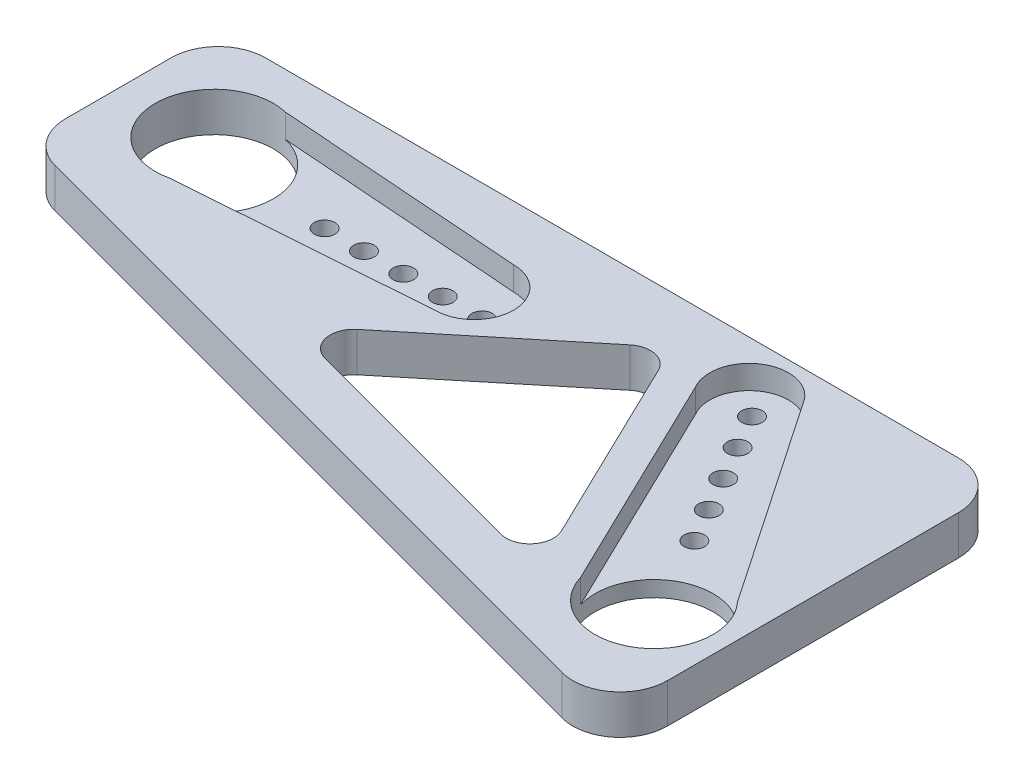
ISO-10303-21;
HEADER;
FILE_DESCRIPTION(('STEP AP214'),'2;1');
FILE_NAME('part.step','',(''),(''),'','','');
FILE_SCHEMA(('AUTOMOTIVE_DESIGN { 1 0 10303 214 1 1 1 1 }'));
ENDSEC;
DATA;
#1=APPLICATION_CONTEXT('core data for automotive mechanical design processes');
#2=APPLICATION_PROTOCOL_DEFINITION('international standard','automotive_design',2000,#1);
#3=PRODUCT_CONTEXT('',#1,'mechanical');
#4=PRODUCT('Part','Part','',(#3));
#5=PRODUCT_RELATED_PRODUCT_CATEGORY('part','',(#4));
#6=PRODUCT_DEFINITION_FORMATION('','',#4);
#7=PRODUCT_DEFINITION_CONTEXT('part definition',#1,'design');
#8=PRODUCT_DEFINITION('design','',#6,#7);
#9=PRODUCT_DEFINITION_SHAPE('','',#8);
#10=(LENGTH_UNIT() NAMED_UNIT(*) SI_UNIT(.MILLI.,.METRE.));
#11=(NAMED_UNIT(*) PLANE_ANGLE_UNIT() SI_UNIT($,.RADIAN.));
#12=(NAMED_UNIT(*) SI_UNIT($,.STERADIAN.) SOLID_ANGLE_UNIT());
#13=UNCERTAINTY_MEASURE_WITH_UNIT(LENGTH_MEASURE(1.E-05),#10,'distance_accuracy_value','');
#14=(GEOMETRIC_REPRESENTATION_CONTEXT(3) GLOBAL_UNCERTAINTY_ASSIGNED_CONTEXT((#13)) GLOBAL_UNIT_ASSIGNED_CONTEXT((#10,
#11,#12)) REPRESENTATION_CONTEXT('',''));
#15=CARTESIAN_POINT('',(0.,0.,0.));
#16=DIRECTION('',(0.,0.,1.));
#17=DIRECTION('',(1.,0.,0.));
#18=AXIS2_PLACEMENT_3D('',#15,#16,#17);
#19=CARTESIAN_POINT('',(37.916201182934,2.5,4.94263164512558));
#20=DIRECTION('',(0.,-1.,0.));
#21=DIRECTION('',(0.,0.,1.));
#22=AXIS2_PLACEMENT_3D('',#19,#20,#21);
#23=CYLINDRICAL_SURFACE('',#22,0.649999999999983);
#24=CARTESIAN_POINT('',(37.916201182934,0.,4.94263164512558));
#25=DIRECTION('',(0.,-1.,0.));
#26=DIRECTION('',(0.,0.,-1.));
#27=AXIS2_PLACEMENT_3D('',#24,#25,#26);
#28=CIRCLE('',#27,0.649999999999983);
#29=CARTESIAN_POINT('',(37.916201182934,0.,4.2926316451256));
#30=VERTEX_POINT('',#29);
#31=EDGE_CURVE('E335',#30,#30,#28,.T.);
#32=ORIENTED_EDGE('',*,*,#31,.T.);
#33=EDGE_LOOP('',(#32));
#34=FACE_BOUND('',#33,.T.);
#35=CARTESIAN_POINT('',(37.916201182934,1.,4.94263164512558));
#36=DIRECTION('',(0.,-1.,0.));
#37=DIRECTION('',(0.,0.,-1.));
#38=AXIS2_PLACEMENT_3D('',#35,#36,#37);
#39=CIRCLE('',#38,0.649999999999983);
#40=CARTESIAN_POINT('',(37.916201182934,1.,4.2926316451256));
#41=VERTEX_POINT('',#40);
#42=EDGE_CURVE('E243',#41,#41,#39,.F.);
#43=ORIENTED_EDGE('',*,*,#42,.T.);
#44=EDGE_LOOP('',(#43));
#45=FACE_BOUND('',#44,.T.);
#46=ADVANCED_FACE('F37',(#34,#45),#23,.F.);
#47=CARTESIAN_POINT('',(39.166201182934,2.5,7.10769515458668));
#48=DIRECTION('',(0.,-1.,0.));
#49=DIRECTION('',(0.,0.,1.));
#50=AXIS2_PLACEMENT_3D('',#47,#48,#49);
#51=CYLINDRICAL_SURFACE('',#50,0.649999999999983);
#52=CARTESIAN_POINT('',(39.166201182934,0.,7.10769515458668));
#53=DIRECTION('',(0.,-1.,0.));
#54=DIRECTION('',(0.,0.,-1.));
#55=AXIS2_PLACEMENT_3D('',#52,#53,#54);
#56=CIRCLE('',#55,0.649999999999983);
#57=CARTESIAN_POINT('',(39.166201182934,0.,6.4576951545867));
#58=VERTEX_POINT('',#57);
#59=EDGE_CURVE('E332',#58,#58,#56,.T.);
#60=ORIENTED_EDGE('',*,*,#59,.T.);
#61=EDGE_LOOP('',(#60));
#62=FACE_BOUND('',#61,.T.);
#63=CARTESIAN_POINT('',(39.166201182934,1.,7.10769515458668));
#64=DIRECTION('',(0.,-1.,0.));
#65=DIRECTION('',(0.,0.,-1.));
#66=AXIS2_PLACEMENT_3D('',#63,#64,#65);
#67=CIRCLE('',#66,0.649999999999983);
#68=CARTESIAN_POINT('',(39.166201182934,1.,6.4576951545867));
#69=VERTEX_POINT('',#68);
#70=EDGE_CURVE('E240',#69,#69,#67,.F.);
#71=ORIENTED_EDGE('',*,*,#70,.T.);
#72=EDGE_LOOP('',(#71));
#73=FACE_BOUND('',#72,.T.);
#74=ADVANCED_FACE('F455',(#62,#73),#51,.F.);
#75=CARTESIAN_POINT('',(40.416201182934,2.5,9.27275866404778));
#76=DIRECTION('',(0.,-1.,0.));
#77=DIRECTION('',(0.,0.,1.));
#78=AXIS2_PLACEMENT_3D('',#75,#76,#77);
#79=CYLINDRICAL_SURFACE('',#78,0.649999999999983);
#80=CARTESIAN_POINT('',(40.416201182934,0.,9.27275866404778));
#81=DIRECTION('',(0.,-1.,0.));
#82=DIRECTION('',(0.,0.,-1.));
#83=AXIS2_PLACEMENT_3D('',#80,#81,#82);
#84=CIRCLE('',#83,0.649999999999983);
#85=CARTESIAN_POINT('',(40.416201182934,0.,8.62275866404779));
#86=VERTEX_POINT('',#85);
#87=EDGE_CURVE('E329',#86,#86,#84,.T.);
#88=ORIENTED_EDGE('',*,*,#87,.T.);
#89=EDGE_LOOP('',(#88));
#90=FACE_BOUND('',#89,.T.);
#91=CARTESIAN_POINT('',(40.416201182934,1.,9.27275866404778));
#92=DIRECTION('',(0.,-1.,0.));
#93=DIRECTION('',(0.,0.,-1.));
#94=AXIS2_PLACEMENT_3D('',#91,#92,#93);
#95=CIRCLE('',#94,0.649999999999983);
#96=CARTESIAN_POINT('',(40.416201182934,1.,8.62275866404779));
#97=VERTEX_POINT('',#96);
#98=EDGE_CURVE('E236',#97,#97,#95,.F.);
#99=ORIENTED_EDGE('',*,*,#98,.T.);
#100=EDGE_LOOP('',(#99));
#101=FACE_BOUND('',#100,.T.);
#102=ADVANCED_FACE('F461',(#90,#101),#79,.F.);
#103=CARTESIAN_POINT('',(41.666201182934,2.5,11.4378221735089));
#104=DIRECTION('',(0.,-1.,0.));
#105=DIRECTION('',(0.,0.,1.));
#106=AXIS2_PLACEMENT_3D('',#103,#104,#105);
#107=CYLINDRICAL_SURFACE('',#106,0.649999999999983);
#108=CARTESIAN_POINT('',(41.666201182934,0.,11.4378221735089));
#109=DIRECTION('',(0.,-1.,0.));
#110=DIRECTION('',(0.,0.,-1.));
#111=AXIS2_PLACEMENT_3D('',#108,#109,#110);
#112=CIRCLE('',#111,0.649999999999983);
#113=CARTESIAN_POINT('',(41.666201182934,0.,10.7878221735089));
#114=VERTEX_POINT('',#113);
#115=EDGE_CURVE('E326',#114,#114,#112,.T.);
#116=ORIENTED_EDGE('',*,*,#115,.T.);
#117=EDGE_LOOP('',(#116));
#118=FACE_BOUND('',#117,.T.);
#119=CARTESIAN_POINT('',(41.666201182934,1.,11.4378221735089));
#120=DIRECTION('',(0.,-1.,0.));
#121=DIRECTION('',(0.,0.,-1.));
#122=AXIS2_PLACEMENT_3D('',#119,#120,#121);
#123=CIRCLE('',#122,0.649999999999983);
#124=CARTESIAN_POINT('',(41.666201182934,1.,10.7878221735089));
#125=VERTEX_POINT('',#124);
#126=EDGE_CURVE('E233',#125,#125,#123,.F.);
#127=ORIENTED_EDGE('',*,*,#126,.T.);
#128=EDGE_LOOP('',(#127));
#129=FACE_BOUND('',#128,.T.);
#130=ADVANCED_FACE('F469',(#118,#129),#107,.F.);
#131=CARTESIAN_POINT('',(22.75,2.5,6.));
#132=DIRECTION('',(0.,-1.,0.));
#133=DIRECTION('',(0.,0.,1.));
#134=AXIS2_PLACEMENT_3D('',#131,#132,#133);
#135=CYLINDRICAL_SURFACE('',#134,0.650000000000001);
#136=CARTESIAN_POINT('',(22.75,0.,6.));
#137=DIRECTION('',(0.,-1.,0.));
#138=DIRECTION('',(0.,0.,-1.));
#139=AXIS2_PLACEMENT_3D('',#136,#137,#138);
#140=CIRCLE('',#139,0.650000000000001);
#141=CARTESIAN_POINT('',(22.75,0.,5.35));
#142=VERTEX_POINT('',#141);
#143=EDGE_CURVE('E323',#142,#142,#140,.T.);
#144=ORIENTED_EDGE('',*,*,#143,.T.);
#145=EDGE_LOOP('',(#144));
#146=FACE_BOUND('',#145,.T.);
#147=CARTESIAN_POINT('',(22.75,1.,6.));
#148=DIRECTION('',(0.,-1.,0.));
#149=DIRECTION('',(0.,0.,-1.));
#150=AXIS2_PLACEMENT_3D('',#147,#148,#149);
#151=CIRCLE('',#150,0.650000000000001);
#152=CARTESIAN_POINT('',(22.75,1.,5.35));
#153=VERTEX_POINT('',#152);
#154=EDGE_CURVE('E424',#153,#153,#151,.F.);
#155=ORIENTED_EDGE('',*,*,#154,.T.);
#156=EDGE_LOOP('',(#155));
#157=FACE_BOUND('',#156,.T.);
#158=ADVANCED_FACE('F473',(#146,#157),#135,.F.);
#159=CARTESIAN_POINT('',(20.25,2.5,6.));
#160=DIRECTION('',(0.,-1.,0.));
#161=DIRECTION('',(0.,0.,1.));
#162=AXIS2_PLACEMENT_3D('',#159,#160,#161);
#163=CYLINDRICAL_SURFACE('',#162,0.650000000000001);
#164=CARTESIAN_POINT('',(20.25,0.,6.));
#165=DIRECTION('',(0.,-1.,0.));
#166=DIRECTION('',(0.,0.,-1.));
#167=AXIS2_PLACEMENT_3D('',#164,#165,#166);
#168=CIRCLE('',#167,0.650000000000001);
#169=CARTESIAN_POINT('',(20.25,0.,5.35));
#170=VERTEX_POINT('',#169);
#171=EDGE_CURVE('E320',#170,#170,#168,.T.);
#172=ORIENTED_EDGE('',*,*,#171,.T.);
#173=EDGE_LOOP('',(#172));
#174=FACE_BOUND('',#173,.T.);
#175=CARTESIAN_POINT('',(20.25,1.,6.));
#176=DIRECTION('',(0.,-1.,0.));
#177=DIRECTION('',(0.,0.,-1.));
#178=AXIS2_PLACEMENT_3D('',#175,#176,#177);
#179=CIRCLE('',#178,0.650000000000001);
#180=CARTESIAN_POINT('',(20.25,1.,5.35));
#181=VERTEX_POINT('',#180);
#182=EDGE_CURVE('E421',#181,#181,#179,.F.);
#183=ORIENTED_EDGE('',*,*,#182,.T.);
#184=EDGE_LOOP('',(#183));
#185=FACE_BOUND('',#184,.T.);
#186=ADVANCED_FACE('F477',(#174,#185),#163,.F.);
#187=CARTESIAN_POINT('',(17.75,2.5,6.));
#188=DIRECTION('',(0.,-1.,0.));
#189=DIRECTION('',(0.,0.,1.));
#190=AXIS2_PLACEMENT_3D('',#187,#188,#189);
#191=CYLINDRICAL_SURFACE('',#190,0.650000000000001);
#192=CARTESIAN_POINT('',(17.75,0.,6.));
#193=DIRECTION('',(0.,-1.,0.));
#194=DIRECTION('',(0.,0.,-1.));
#195=AXIS2_PLACEMENT_3D('',#192,#193,#194);
#196=CIRCLE('',#195,0.650000000000001);
#197=CARTESIAN_POINT('',(17.75,0.,5.35));
#198=VERTEX_POINT('',#197);
#199=EDGE_CURVE('E317',#198,#198,#196,.T.);
#200=ORIENTED_EDGE('',*,*,#199,.T.);
#201=EDGE_LOOP('',(#200));
#202=FACE_BOUND('',#201,.T.);
#203=CARTESIAN_POINT('',(17.75,1.,6.));
#204=DIRECTION('',(0.,-1.,0.));
#205=DIRECTION('',(0.,0.,-1.));
#206=AXIS2_PLACEMENT_3D('',#203,#204,#205);
#207=CIRCLE('',#206,0.650000000000001);
#208=CARTESIAN_POINT('',(17.75,1.,5.35));
#209=VERTEX_POINT('',#208);
#210=EDGE_CURVE('E213',#209,#209,#207,.F.);
#211=ORIENTED_EDGE('',*,*,#210,.T.);
#212=EDGE_LOOP('',(#211));
#213=FACE_BOUND('',#212,.T.);
#214=ADVANCED_FACE('F429',(#202,#213),#191,.F.);
#215=CARTESIAN_POINT('',(15.25,2.5,6.));
#216=DIRECTION('',(0.,-1.,0.));
#217=DIRECTION('',(0.,0.,1.));
#218=AXIS2_PLACEMENT_3D('',#215,#216,#217);
#219=CYLINDRICAL_SURFACE('',#218,0.650000000000001);
#220=CARTESIAN_POINT('',(15.25,0.,6.));
#221=DIRECTION('',(0.,-1.,0.));
#222=DIRECTION('',(0.,0.,-1.));
#223=AXIS2_PLACEMENT_3D('',#220,#221,#222);
#224=CIRCLE('',#223,0.650000000000001);
#225=CARTESIAN_POINT('',(15.25,0.,5.35));
#226=VERTEX_POINT('',#225);
#227=EDGE_CURVE('E314',#226,#226,#224,.T.);
#228=ORIENTED_EDGE('',*,*,#227,.T.);
#229=EDGE_LOOP('',(#228));
#230=FACE_BOUND('',#229,.T.);
#231=CARTESIAN_POINT('',(15.25,1.,6.));
#232=DIRECTION('',(0.,-1.,0.));
#233=DIRECTION('',(0.,0.,-1.));
#234=AXIS2_PLACEMENT_3D('',#231,#232,#233);
#235=CIRCLE('',#234,0.650000000000001);
#236=CARTESIAN_POINT('',(15.25,1.,5.35));
#237=VERTEX_POINT('',#236);
#238=EDGE_CURVE('E226',#237,#237,#235,.F.);
#239=ORIENTED_EDGE('',*,*,#238,.T.);
#240=EDGE_LOOP('',(#239));
#241=FACE_BOUND('',#240,.T.);
#242=ADVANCED_FACE('F441',(#230,#241),#219,.F.);
#243=CARTESIAN_POINT('',(12.75,2.5,6.));
#244=DIRECTION('',(0.,-1.,0.));
#245=DIRECTION('',(0.,0.,1.));
#246=AXIS2_PLACEMENT_3D('',#243,#244,#245);
#247=CYLINDRICAL_SURFACE('',#246,0.650000000000001);
#248=CARTESIAN_POINT('',(12.75,0.,6.));
#249=DIRECTION('',(0.,-1.,0.));
#250=DIRECTION('',(0.,0.,-1.));
#251=AXIS2_PLACEMENT_3D('',#248,#249,#250);
#252=CIRCLE('',#251,0.650000000000001);
#253=CARTESIAN_POINT('',(12.75,0.,5.35));
#254=VERTEX_POINT('',#253);
#255=EDGE_CURVE('E311',#254,#254,#252,.T.);
#256=ORIENTED_EDGE('',*,*,#255,.T.);
#257=EDGE_LOOP('',(#256));
#258=FACE_BOUND('',#257,.T.);
#259=CARTESIAN_POINT('',(12.75,1.,6.));
#260=DIRECTION('',(0.,-1.,0.));
#261=DIRECTION('',(0.,0.,-1.));
#262=AXIS2_PLACEMENT_3D('',#259,#260,#261);
#263=CIRCLE('',#262,0.650000000000001);
#264=CARTESIAN_POINT('',(12.75,1.,5.35));
#265=VERTEX_POINT('',#264);
#266=EDGE_CURVE('E210',#265,#265,#263,.F.);
#267=ORIENTED_EDGE('',*,*,#266,.T.);
#268=EDGE_LOOP('',(#267));
#269=FACE_BOUND('',#268,.T.);
#270=ADVANCED_FACE('F438',(#258,#269),#247,.F.);
#271=CARTESIAN_POINT('',(36.666201182934,2.5,2.77756813566448));
#272=DIRECTION('',(0.,-1.,0.));
#273=DIRECTION('',(0.,0.,1.));
#274=AXIS2_PLACEMENT_3D('',#271,#272,#273);
#275=CYLINDRICAL_SURFACE('',#274,0.649999999999975);
#276=CARTESIAN_POINT('',(36.666201182934,0.,2.77756813566448));
#277=DIRECTION('',(0.,-1.,0.));
#278=DIRECTION('',(0.,0.,-1.));
#279=AXIS2_PLACEMENT_3D('',#276,#277,#278);
#280=CIRCLE('',#279,0.649999999999975);
#281=CARTESIAN_POINT('',(36.666201182934,0.,2.12756813566451));
#282=VERTEX_POINT('',#281);
#283=EDGE_CURVE('E278',#282,#282,#280,.T.);
#284=ORIENTED_EDGE('',*,*,#283,.T.);
#285=EDGE_LOOP('',(#284));
#286=FACE_BOUND('',#285,.T.);
#287=CARTESIAN_POINT('',(36.666201182934,1.,2.77756813566448));
#288=DIRECTION('',(0.,-1.,0.));
#289=DIRECTION('',(0.,0.,-1.));
#290=AXIS2_PLACEMENT_3D('',#287,#288,#289);
#291=CIRCLE('',#290,0.649999999999975);
#292=CARTESIAN_POINT('',(36.666201182934,1.,2.12756813566451));
#293=VERTEX_POINT('',#292);
#294=EDGE_CURVE('E246',#293,#293,#291,.F.);
#295=ORIENTED_EDGE('',*,*,#294,.T.);
#296=EDGE_LOOP('',(#295));
#297=FACE_BOUND('',#296,.T.);
#298=ADVANCED_FACE('F440',(#286,#297),#275,.F.);
#299=CARTESIAN_POINT('',(50.,2.5,0.));
#300=DIRECTION('',(1.,0.,0.));
#301=DIRECTION('',(0.,0.,1.));
#302=AXIS2_PLACEMENT_3D('',#299,#300,#301);
#303=PLANE('',#302);
#304=DIRECTION('',(0.,0.,-1.));
#305=VECTOR('',#304,1.);
#306=CARTESIAN_POINT('',(50.,0.,0.));
#307=LINE('',#306,#305);
#308=CARTESIAN_POINT('',(50.,0.,21.4877835030326));
#309=VERTEX_POINT('',#308);
#310=CARTESIAN_POINT('',(50.,0.,3.));
#311=VERTEX_POINT('',#310);
#312=EDGE_CURVE('E299',#309,#311,#307,.T.);
#313=ORIENTED_EDGE('',*,*,#312,.T.);
#314=DIRECTION('',(0.,-1.,0.));
#315=VECTOR('',#314,1.);
#316=CARTESIAN_POINT('',(50.,0.,3.));
#317=LINE('',#316,#315);
#318=CARTESIAN_POINT('',(50.,2.5,3.));
#319=VERTEX_POINT('',#318);
#320=EDGE_CURVE('E373',#319,#311,#317,.T.);
#321=ORIENTED_EDGE('',*,*,#320,.F.);
#322=DIRECTION('',(0.,0.,-1.));
#323=VECTOR('',#322,1.);
#324=CARTESIAN_POINT('',(50.,2.5,0.));
#325=LINE('',#324,#323);
#326=CARTESIAN_POINT('',(50.,2.5,21.4877835030326));
#327=VERTEX_POINT('',#326);
#328=EDGE_CURVE('E281',#327,#319,#325,.T.);
#329=ORIENTED_EDGE('',*,*,#328,.F.);
#330=DIRECTION('',(0.,-1.,0.));
#331=VECTOR('',#330,1.);
#332=CARTESIAN_POINT('',(50.,2.5,21.4877835030326));
#333=LINE('',#332,#331);
#334=EDGE_CURVE('E376',#309,#327,#333,.F.);
#335=ORIENTED_EDGE('',*,*,#334,.F.);
#336=EDGE_LOOP('',(#313,#321,#329,#335));
#337=FACE_BOUND('',#336,.T.);
#338=ADVANCED_FACE('F448',(#337),#303,.T.);
#339=CARTESIAN_POINT('',(-3.00000000000001,2.5,11.1961524227066));
#340=DIRECTION('',(-0.258819045102522,0.,0.965925826289068));
#341=DIRECTION('',(-0.965925826289068,0.,-0.258819045102522));
#342=AXIS2_PLACEMENT_3D('',#339,#340,#341);
#343=PLANE('',#342);
#344=DIRECTION('',(0.965925826289068,0.,0.258819045102522));
#345=VECTOR('',#344,1.);
#346=CARTESIAN_POINT('',(-3.00000000000001,0.,11.1961524227066));
#347=LINE('',#346,#345);
#348=CARTESIAN_POINT('',(2.22354286469244,0.,12.5957965149303));
#349=VERTEX_POINT('',#348);
#350=CARTESIAN_POINT('',(46.2235428646924,0.,24.3855609818998));
#351=VERTEX_POINT('',#350);
#352=EDGE_CURVE('E302',#349,#351,#347,.T.);
#353=ORIENTED_EDGE('',*,*,#352,.T.);
#354=DIRECTION('',(0.,-1.,0.));
#355=VECTOR('',#354,1.);
#356=CARTESIAN_POINT('',(46.2235428646924,2.5,24.3855609818998));
#357=LINE('',#356,#355);
#358=CARTESIAN_POINT('',(46.2235428646924,2.5,24.3855609818998));
#359=VERTEX_POINT('',#358);
#360=EDGE_CURVE('E367',#359,#351,#357,.T.);
#361=ORIENTED_EDGE('',*,*,#360,.F.);
#362=DIRECTION('',(0.965925826289068,0.,0.258819045102522));
#363=VECTOR('',#362,1.);
#364=CARTESIAN_POINT('',(-3.00000000000001,2.5,11.1961524227066));
#365=LINE('',#364,#363);
#366=CARTESIAN_POINT('',(2.22354286469244,2.5,12.5957965149303));
#367=VERTEX_POINT('',#366);
#368=EDGE_CURVE('E284',#367,#359,#365,.T.);
#369=ORIENTED_EDGE('',*,*,#368,.F.);
#370=DIRECTION('',(0.,-1.,0.));
#371=VECTOR('',#370,1.);
#372=CARTESIAN_POINT('',(2.22354286469244,2.5,12.5957965149303));
#373=LINE('',#372,#371);
#374=EDGE_CURVE('E370',#349,#367,#373,.F.);
#375=ORIENTED_EDGE('',*,*,#374,.F.);
#376=EDGE_LOOP('',(#353,#361,#369,#375));
#377=FACE_BOUND('',#376,.T.);
#378=ADVANCED_FACE('F760',(#377),#343,.T.);
#379=CARTESIAN_POINT('',(0.,2.5,0.));
#380=DIRECTION('',(-1.,0.,0.));
#381=DIRECTION('',(0.,0.,-1.));
#382=AXIS2_PLACEMENT_3D('',#379,#380,#381);
#383=PLANE('',#382);
#384=DIRECTION('',(0.,0.,1.));
#385=VECTOR('',#384,1.);
#386=CARTESIAN_POINT('',(0.,0.,0.));
#387=LINE('',#386,#385);
#388=CARTESIAN_POINT('',(0.,0.,3.));
#389=VERTEX_POINT('',#388);
#390=CARTESIAN_POINT('',(0.,0.,9.69801903606312));
#391=VERTEX_POINT('',#390);
#392=EDGE_CURVE('E305',#389,#391,#387,.T.);
#393=ORIENTED_EDGE('',*,*,#392,.T.);
#394=DIRECTION('',(0.,-1.,0.));
#395=VECTOR('',#394,1.);
#396=CARTESIAN_POINT('',(0.,2.5,9.69801903606312));
#397=LINE('',#396,#395);
#398=CARTESIAN_POINT('',(0.,2.5,9.69801903606312));
#399=VERTEX_POINT('',#398);
#400=EDGE_CURVE('E353',#399,#391,#397,.T.);
#401=ORIENTED_EDGE('',*,*,#400,.F.);
#402=DIRECTION('',(0.,0.,1.));
#403=VECTOR('',#402,1.);
#404=CARTESIAN_POINT('',(0.,2.5,0.));
#405=LINE('',#404,#403);
#406=CARTESIAN_POINT('',(0.,2.5,3.));
#407=VERTEX_POINT('',#406);
#408=EDGE_CURVE('E287',#407,#399,#405,.T.);
#409=ORIENTED_EDGE('',*,*,#408,.F.);
#410=DIRECTION('',(0.,-1.,0.));
#411=VECTOR('',#410,1.);
#412=CARTESIAN_POINT('',(0.,2.5,3.));
#413=LINE('',#412,#411);
#414=EDGE_CURVE('E356',#389,#407,#413,.F.);
#415=ORIENTED_EDGE('',*,*,#414,.F.);
#416=EDGE_LOOP('',(#393,#401,#409,#415));
#417=FACE_BOUND('',#416,.T.);
#418=ADVANCED_FACE('F751',(#417),#383,.T.);
#419=CARTESIAN_POINT('',(0.,2.5,0.));
#420=DIRECTION('',(0.,0.,1.));
#421=DIRECTION('',(-1.,0.,0.));
#422=AXIS2_PLACEMENT_3D('',#419,#420,#421);
#423=PLANE('',#422);
#424=DIRECTION('',(1.,0.,0.));
#425=VECTOR('',#424,1.);
#426=CARTESIAN_POINT('',(0.,2.5,0.));
#427=LINE('',#426,#425);
#428=CARTESIAN_POINT('',(3.,2.5,0.));
#429=VERTEX_POINT('',#428);
#430=CARTESIAN_POINT('',(47.,2.5,0.));
#431=VERTEX_POINT('',#430);
#432=EDGE_CURVE('E290',#429,#431,#427,.T.);
#433=ORIENTED_EDGE('',*,*,#432,.T.);
#434=DIRECTION('',(0.,-1.,0.));
#435=VECTOR('',#434,1.);
#436=CARTESIAN_POINT('',(47.,2.5,0.));
#437=LINE('',#436,#435);
#438=CARTESIAN_POINT('',(47.,0.,0.));
#439=VERTEX_POINT('',#438);
#440=EDGE_CURVE('E293',#439,#431,#437,.F.);
#441=ORIENTED_EDGE('',*,*,#440,.F.);
#442=DIRECTION('',(1.,0.,0.));
#443=VECTOR('',#442,1.);
#444=CARTESIAN_POINT('',(0.,0.,0.));
#445=LINE('',#444,#443);
#446=CARTESIAN_POINT('',(3.,0.,0.));
#447=VERTEX_POINT('',#446);
#448=EDGE_CURVE('E308',#447,#439,#445,.T.);
#449=ORIENTED_EDGE('',*,*,#448,.F.);
#450=DIRECTION('',(0.,-1.,0.));
#451=VECTOR('',#450,1.);
#452=CARTESIAN_POINT('',(3.,0.,0.));
#453=LINE('',#452,#451);
#454=EDGE_CURVE('E342',#429,#447,#453,.T.);
#455=ORIENTED_EDGE('',*,*,#454,.F.);
#456=EDGE_LOOP('',(#433,#441,#449,#455));
#457=FACE_BOUND('',#456,.T.);
#458=ADVANCED_FACE('F552',(#457),#423,.F.);
#459=CARTESIAN_POINT('',(5.75,2.5,6.));
#460=DIRECTION('',(0.,-1.,0.));
#461=DIRECTION('',(0.,0.,1.));
#462=AXIS2_PLACEMENT_3D('',#459,#460,#461);
#463=CYLINDRICAL_SURFACE('',#462,3.75);
#464=DIRECTION('',(0.,1.,0.));
#465=VECTOR('',#464,1.);
#466=CARTESIAN_POINT('',(6.61023252670425,1.,2.35));
#467=LINE('',#466,#465);
#468=CARTESIAN_POINT('',(6.61023252670425,1.,2.35));
#469=VERTEX_POINT('',#468);
#470=CARTESIAN_POINT('',(6.61023252670425,2.5,2.35));
#471=VERTEX_POINT('',#470);
#472=EDGE_CURVE('E209',#469,#471,#467,.T.);
#473=ORIENTED_EDGE('',*,*,#472,.T.);
#474=CARTESIAN_POINT('',(5.75,2.5,6.));
#475=DIRECTION('',(0.,-1.,0.));
#476=DIRECTION('',(0.,0.,-1.));
#477=AXIS2_PLACEMENT_3D('',#474,#475,#476);
#478=CIRCLE('',#477,3.75);
#479=CARTESIAN_POINT('',(6.61023252670424,2.5,9.65));
#480=VERTEX_POINT('',#479);
#481=EDGE_CURVE('E277',#480,#471,#478,.T.);
#482=ORIENTED_EDGE('',*,*,#481,.F.);
#483=DIRECTION('',(0.,1.,0.));
#484=VECTOR('',#483,1.);
#485=CARTESIAN_POINT('',(6.61023252670424,1.,9.65));
#486=LINE('',#485,#484);
#487=CARTESIAN_POINT('',(6.61023252670424,1.,9.65));
#488=VERTEX_POINT('',#487);
#489=EDGE_CURVE('E229',#488,#480,#486,.T.);
#490=ORIENTED_EDGE('',*,*,#489,.F.);
#491=CARTESIAN_POINT('',(5.75,1.,6.));
#492=DIRECTION('',(0.,-1.,0.));
#493=DIRECTION('',(0.,0.,-1.));
#494=AXIS2_PLACEMENT_3D('',#491,#492,#493);
#495=CIRCLE('',#494,3.75);
#496=EDGE_CURVE('E204',#488,#469,#495,.F.);
#497=ORIENTED_EDGE('',*,*,#496,.T.);
#498=EDGE_LOOP('',(#473,#482,#490,#497));
#499=FACE_BOUND('',#498,.T.);
#500=CARTESIAN_POINT('',(5.75,0.,6.));
#501=DIRECTION('',(0.,-1.,0.));
#502=DIRECTION('',(0.,0.,-1.));
#503=AXIS2_PLACEMENT_3D('',#500,#501,#502);
#504=CIRCLE('',#503,3.75);
#505=CARTESIAN_POINT('',(5.75,0.,2.25));
#506=VERTEX_POINT('',#505);
#507=EDGE_CURVE('E296',#506,#506,#504,.T.);
#508=ORIENTED_EDGE('',*,*,#507,.T.);
#509=EDGE_LOOP('',(#508));
#510=FACE_BOUND('',#509,.T.);
#511=ADVANCED_FACE('F547',(#499,#510),#463,.F.);
#512=CARTESIAN_POINT('',(45.166201182934,2.5,17.5));
#513=DIRECTION('',(0.,-1.,0.));
#514=DIRECTION('',(0.,0.,1.));
#515=AXIS2_PLACEMENT_3D('',#512,#513,#514);
#516=CYLINDRICAL_SURFACE('',#515,3.75000000000001);
#517=DIRECTION('',(0.,1.,0.));
#518=VECTOR('',#517,1.);
#519=CARTESIAN_POINT('',(47.8970776433951,1.,14.9300167787124));
#520=LINE('',#519,#518);
#521=CARTESIAN_POINT('',(47.8970776433951,1.,14.9300167787124));
#522=VERTEX_POINT('',#521);
#523=CARTESIAN_POINT('',(47.8970776433951,2.5,14.9300167787124));
#524=VERTEX_POINT('',#523);
#525=EDGE_CURVE('E221',#522,#524,#520,.T.);
#526=ORIENTED_EDGE('',*,*,#525,.F.);
#527=CARTESIAN_POINT('',(45.166201182934,1.,17.5));
#528=DIRECTION('',(0.,-1.,0.));
#529=DIRECTION('',(0.,0.,-1.));
#530=AXIS2_PLACEMENT_3D('',#527,#528,#529);
#531=CIRCLE('',#530,3.75000000000001);
#532=CARTESIAN_POINT('',(41.5750921957686,1.,18.5800167787124));
#533=VERTEX_POINT('',#532);
#534=EDGE_CURVE('E249',#522,#533,#531,.F.);
#535=ORIENTED_EDGE('',*,*,#534,.T.);
#536=DIRECTION('',(0.,1.,0.));
#537=VECTOR('',#536,1.);
#538=CARTESIAN_POINT('',(41.5750921957686,1.,18.5800167787124));
#539=LINE('',#538,#537);
#540=CARTESIAN_POINT('',(41.5750921957686,2.5,18.5800167787124));
#541=VERTEX_POINT('',#540);
#542=EDGE_CURVE('E258',#533,#541,#539,.T.);
#543=ORIENTED_EDGE('',*,*,#542,.T.);
#544=CARTESIAN_POINT('',(45.166201182934,2.5,17.5));
#545=DIRECTION('',(0.,-1.,0.));
#546=DIRECTION('',(0.,0.,-1.));
#547=AXIS2_PLACEMENT_3D('',#544,#545,#546);
#548=CIRCLE('',#547,3.75000000000001);
#549=EDGE_CURVE('E274',#524,#541,#548,.T.);
#550=ORIENTED_EDGE('',*,*,#549,.F.);
#551=EDGE_LOOP('',(#526,#535,#543,#550));
#552=FACE_BOUND('',#551,.T.);
#553=CARTESIAN_POINT('',(45.166201182934,0.,17.5));
#554=DIRECTION('',(0.,-1.,0.));
#555=DIRECTION('',(0.,0.,-1.));
#556=AXIS2_PLACEMENT_3D('',#553,#554,#555);
#557=CIRCLE('',#556,3.75000000000001);
#558=CARTESIAN_POINT('',(45.166201182934,0.,13.75));
#559=VERTEX_POINT('',#558);
#560=EDGE_CURVE('E228',#559,#559,#557,.T.);
#561=ORIENTED_EDGE('',*,*,#560,.T.);
#562=EDGE_LOOP('',(#561));
#563=FACE_BOUND('',#562,.T.);
#564=ADVANCED_FACE('F523',(#552,#563),#516,.F.);
#565=CARTESIAN_POINT('',(0.,2.5,0.));
#566=DIRECTION('',(0.,1.,0.));
#567=DIRECTION('',(0.,0.,-1.));
#568=AXIS2_PLACEMENT_3D('',#565,#566,#567);
#569=PLANE('',#568);
#570=DIRECTION('',(0.772896236920538,0.,-0.634532431759064));
#571=VECTOR('',#570,1.);
#572=CARTESIAN_POINT('',(31.8239018815725,2.5,3.));
#573=LINE('',#572,#571);
#574=CARTESIAN_POINT('',(20.8368383712595,2.5,12.0201605261625));
#575=VERTEX_POINT('',#574);
#576=CARTESIAN_POINT('',(30.3508831143184,2.5,4.20931909842973));
#577=VERTEX_POINT('',#576);
#578=EDGE_CURVE('E415',#575,#577,#573,.T.);
#579=ORIENTED_EDGE('',*,*,#578,.T.);
#580=CARTESIAN_POINT('',(31.302681761957,2.5,5.36866345381055));
#581=DIRECTION('',(0.,-1.,0.));
#582=DIRECTION('',(0.,0.,-1.));
#583=AXIS2_PLACEMENT_3D('',#580,#581,#582);
#584=CIRCLE('',#583,1.5);
#585=CARTESIAN_POINT('',(32.6532216622906,2.5,4.71594454217478));
#586=VERTEX_POINT('',#585);
#587=EDGE_CURVE('E389',#586,#577,#584,.F.);
#588=ORIENTED_EDGE('',*,*,#587,.F.);
#589=DIRECTION('',(0.435145941090512,0.,0.900359933555716));
#590=VECTOR('',#589,1.);
#591=CARTESIAN_POINT('',(39.830655129258,2.5,19.566763334657));
#592=LINE('',#591,#590);
#593=CARTESIAN_POINT('',(38.4051714919912,2.5,16.6172968873363));
#594=VERTEX_POINT('',#593);
#595=EDGE_CURVE('E410',#586,#594,#592,.T.);
#596=ORIENTED_EDGE('',*,*,#595,.T.);
#597=CARTESIAN_POINT('',(37.0546315916577,2.5,17.2700157989721));
#598=DIRECTION('',(0.,-1.,0.));
#599=DIRECTION('',(0.,0.,-1.));
#600=AXIS2_PLACEMENT_3D('',#597,#598,#599);
#601=CIRCLE('',#600,1.5);
#602=CARTESIAN_POINT('',(36.6664030240039,2.5,18.7189045384057));
#603=VERTEX_POINT('',#602);
#604=EDGE_CURVE('E395',#603,#594,#601,.F.);
#605=ORIENTED_EDGE('',*,*,#604,.F.);
#606=DIRECTION('',(-0.965925826289068,0.,-0.258819045102521));
#607=VECTOR('',#606,1.);
#608=CARTESIAN_POINT('',(18.5802869508985,2.5,13.8727443424015));
#609=LINE('',#608,#607);
#610=CARTESIAN_POINT('',(21.4004084512444,2.5,14.6283936209769));
#611=VERTEX_POINT('',#610);
#612=EDGE_CURVE('E405',#603,#611,#609,.T.);
#613=ORIENTED_EDGE('',*,*,#612,.T.);
#614=CARTESIAN_POINT('',(21.7886370188981,2.5,13.1795048815433));
#615=DIRECTION('',(0.,-1.,0.));
#616=DIRECTION('',(0.,0.,-1.));
#617=AXIS2_PLACEMENT_3D('',#614,#615,#616);
#618=CIRCLE('',#617,1.5);
#619=EDGE_CURVE('E45',#575,#611,#618,.F.);
#620=ORIENTED_EDGE('',*,*,#619,.F.);
#621=EDGE_LOOP('',(#579,#588,#596,#605,#613,#620));
#622=FACE_BOUND('',#621,.T.);
#623=DIRECTION('',(0.997307545554175,0.,0.0733325274397841));
#624=VECTOR('',#623,1.);
#625=CARTESIAN_POINT('',(-0.13631986465517,2.5,1.85392259582435));
#626=LINE('',#625,#624);
#627=CARTESIAN_POINT('',(22.25,2.5,3.5));
#628=VERTEX_POINT('',#627);
#629=EDGE_CURVE('E219',#471,#628,#626,.T.);
#630=ORIENTED_EDGE('',*,*,#629,.T.);
#631=CARTESIAN_POINT('',(22.25,2.5,6.));
#632=DIRECTION('',(0.,-1.,0.));
#633=DIRECTION('',(0.,0.,-1.));
#634=AXIS2_PLACEMENT_3D('',#631,#632,#633);
#635=CIRCLE('',#634,2.5);
#636=CARTESIAN_POINT('',(22.25,2.5,8.5));
#637=VERTEX_POINT('',#636);
#638=EDGE_CURVE('E200',#628,#637,#635,.T.);
#639=ORIENTED_EDGE('',*,*,#638,.T.);
#640=DIRECTION('',(0.997307545554175,0.,-0.0733325274397841));
#641=VECTOR('',#640,1.);
#642=CARTESIAN_POINT('',(0.741301130747893,2.5,10.0815454892072));
#643=LINE('',#642,#641);
#644=EDGE_CURVE('E223',#480,#637,#643,.T.);
#645=ORIENTED_EDGE('',*,*,#644,.F.);
#646=ORIENTED_EDGE('',*,*,#481,.T.);
#647=EDGE_LOOP('',(#630,#639,#645,#646));
#648=FACE_BOUND('',#647,.T.);
#649=DIRECTION('',(0.562161604463658,0.,0.827027406115932));
#650=VECTOR('',#649,1.);
#651=CARTESIAN_POINT('',(25.8190626220352,2.5,-17.5501870458164));
#652=LINE('',#651,#650);
#653=CARTESIAN_POINT('',(39.0812646923951,2.5,1.96058083755671));
#654=VERTEX_POINT('',#653);
#655=EDGE_CURVE('E237',#654,#524,#652,.T.);
#656=ORIENTED_EDGE('',*,*,#655,.T.);
#657=ORIENTED_EDGE('',*,*,#549,.T.);
#658=DIRECTION('',(0.435145941090513,0.,0.900359933555715));
#659=VECTOR('',#658,1.);
#660=CARTESIAN_POINT('',(26.4233386845084,2.5,-12.7704578470253));
#661=LINE('',#660,#659);
#662=CARTESIAN_POINT('',(34.7511376734729,2.5,4.46058083755669));
#663=VERTEX_POINT('',#662);
#664=EDGE_CURVE('E259',#663,#541,#661,.T.);
#665=ORIENTED_EDGE('',*,*,#664,.F.);
#666=CARTESIAN_POINT('',(36.916201182934,2.5,3.2105808375567));
#667=DIRECTION('',(0.,-1.,0.));
#668=DIRECTION('',(0.,0.,-1.));
#669=AXIS2_PLACEMENT_3D('',#666,#667,#668);
#670=CIRCLE('',#669,2.5);
#671=EDGE_CURVE('E261',#663,#654,#670,.T.);
#672=ORIENTED_EDGE('',*,*,#671,.T.);
#673=EDGE_LOOP('',(#656,#657,#665,#672));
#674=FACE_BOUND('',#673,.T.);
#675=ORIENTED_EDGE('',*,*,#408,.T.);
#676=CARTESIAN_POINT('',(3.,2.5,9.69801903606312));
#677=DIRECTION('',(0.,-1.,0.));
#678=DIRECTION('',(0.,0.,-1.));
#679=AXIS2_PLACEMENT_3D('',#676,#677,#678);
#680=CIRCLE('',#679,3.);
#681=EDGE_CURVE('E363',#367,#399,#680,.T.);
#682=ORIENTED_EDGE('',*,*,#681,.F.);
#683=ORIENTED_EDGE('',*,*,#368,.T.);
#684=CARTESIAN_POINT('',(47.,2.5,21.4877835030326));
#685=DIRECTION('',(0.,-1.,0.));
#686=DIRECTION('',(0.,0.,-1.));
#687=AXIS2_PLACEMENT_3D('',#684,#685,#686);
#688=CIRCLE('',#687,3.);
#689=EDGE_CURVE('E361',#327,#359,#688,.T.);
#690=ORIENTED_EDGE('',*,*,#689,.F.);
#691=ORIENTED_EDGE('',*,*,#328,.T.);
#692=CARTESIAN_POINT('',(47.,2.5,3.));
#693=DIRECTION('',(0.,-1.,0.));
#694=DIRECTION('',(0.,0.,-1.));
#695=AXIS2_PLACEMENT_3D('',#692,#693,#694);
#696=CIRCLE('',#695,3.);
#697=EDGE_CURVE('E359',#431,#319,#696,.T.);
#698=ORIENTED_EDGE('',*,*,#697,.F.);
#699=ORIENTED_EDGE('',*,*,#432,.F.);
#700=CARTESIAN_POINT('',(3.,2.5,3.));
#701=DIRECTION('',(0.,-1.,0.));
#702=DIRECTION('',(0.,0.,-1.));
#703=AXIS2_PLACEMENT_3D('',#700,#701,#702);
#704=CIRCLE('',#703,3.);
#705=EDGE_CURVE('E365',#407,#429,#704,.T.);
#706=ORIENTED_EDGE('',*,*,#705,.F.);
#707=EDGE_LOOP('',(#675,#682,#683,#690,#691,#698,#699,#706));
#708=FACE_BOUND('',#707,.T.);
#709=ADVANCED_FACE('F406',(#622,#648,#674,#708),#569,.T.);
#710=CARTESIAN_POINT('',(0.,0.,0.));
#711=DIRECTION('',(0.,1.,0.));
#712=DIRECTION('',(0.,0.,-1.));
#713=AXIS2_PLACEMENT_3D('',#710,#711,#712);
#714=PLANE('',#713);
#715=DIRECTION('',(0.435145941090512,0.,0.900359933555716));
#716=VECTOR('',#715,1.);
#717=CARTESIAN_POINT('',(39.830655129258,0.,19.566763334657));
#718=LINE('',#717,#716);
#719=CARTESIAN_POINT('',(32.6532216622906,0.,4.71594454217478));
#720=VERTEX_POINT('',#719);
#721=CARTESIAN_POINT('',(38.4051714919912,0.,16.6172968873363));
#722=VERTEX_POINT('',#721);
#723=EDGE_CURVE('E413',#720,#722,#718,.T.);
#724=ORIENTED_EDGE('',*,*,#723,.F.);
#725=CARTESIAN_POINT('',(31.302681761957,0.,5.36866345381055));
#726=DIRECTION('',(0.,-1.,0.));
#727=DIRECTION('',(0.,0.,-1.));
#728=AXIS2_PLACEMENT_3D('',#725,#726,#727);
#729=CIRCLE('',#728,1.5);
#730=CARTESIAN_POINT('',(30.3508831143184,0.,4.20931909842973));
#731=VERTEX_POINT('',#730);
#732=EDGE_CURVE('E392',#731,#720,#729,.T.);
#733=ORIENTED_EDGE('',*,*,#732,.F.);
#734=DIRECTION('',(0.772896236920538,0.,-0.634532431759064));
#735=VECTOR('',#734,1.);
#736=CARTESIAN_POINT('',(31.8239018815725,0.,3.));
#737=LINE('',#736,#735);
#738=CARTESIAN_POINT('',(20.8368383712595,0.,12.0201605261625));
#739=VERTEX_POINT('',#738);
#740=EDGE_CURVE('E409',#739,#731,#737,.T.);
#741=ORIENTED_EDGE('',*,*,#740,.F.);
#742=CARTESIAN_POINT('',(21.7886370188981,0.,13.1795048815433));
#743=DIRECTION('',(0.,-1.,0.));
#744=DIRECTION('',(0.,0.,-1.));
#745=AXIS2_PLACEMENT_3D('',#742,#743,#744);
#746=CIRCLE('',#745,1.5);
#747=CARTESIAN_POINT('',(21.4004084512444,0.,14.6283936209769));
#748=VERTEX_POINT('',#747);
#749=EDGE_CURVE('E11',#748,#739,#746,.T.);
#750=ORIENTED_EDGE('',*,*,#749,.F.);
#751=DIRECTION('',(-0.965925826289068,0.,-0.258819045102521));
#752=VECTOR('',#751,1.);
#753=CARTESIAN_POINT('',(18.5802869508985,0.,13.8727443424015));
#754=LINE('',#753,#752);
#755=CARTESIAN_POINT('',(36.6664030240039,0.,18.7189045384057));
#756=VERTEX_POINT('',#755);
#757=EDGE_CURVE('E262',#756,#748,#754,.T.);
#758=ORIENTED_EDGE('',*,*,#757,.F.);
#759=CARTESIAN_POINT('',(37.0546315916577,0.,17.2700157989721));
#760=DIRECTION('',(0.,-1.,0.));
#761=DIRECTION('',(0.,0.,-1.));
#762=AXIS2_PLACEMENT_3D('',#759,#760,#761);
#763=CIRCLE('',#762,1.5);
#764=EDGE_CURVE('E398',#722,#756,#763,.T.);
#765=ORIENTED_EDGE('',*,*,#764,.F.);
#766=EDGE_LOOP('',(#724,#733,#741,#750,#758,#765));
#767=FACE_BOUND('',#766,.T.);
#768=ORIENTED_EDGE('',*,*,#560,.F.);
#769=EDGE_LOOP('',(#768));
#770=FACE_BOUND('',#769,.T.);
#771=ORIENTED_EDGE('',*,*,#507,.F.);
#772=EDGE_LOOP('',(#771));
#773=FACE_BOUND('',#772,.T.);
#774=ORIENTED_EDGE('',*,*,#448,.T.);
#775=CARTESIAN_POINT('',(47.,0.,3.));
#776=DIRECTION('',(0.,-1.,0.));
#777=DIRECTION('',(0.,0.,-1.));
#778=AXIS2_PLACEMENT_3D('',#775,#776,#777);
#779=CIRCLE('',#778,3.);
#780=EDGE_CURVE('E345',#311,#439,#779,.F.);
#781=ORIENTED_EDGE('',*,*,#780,.F.);
#782=ORIENTED_EDGE('',*,*,#312,.F.);
#783=CARTESIAN_POINT('',(47.,0.,21.4877835030326));
#784=DIRECTION('',(0.,-1.,0.));
#785=DIRECTION('',(0.,0.,-1.));
#786=AXIS2_PLACEMENT_3D('',#783,#784,#785);
#787=CIRCLE('',#786,3.);
#788=EDGE_CURVE('E347',#351,#309,#787,.F.);
#789=ORIENTED_EDGE('',*,*,#788,.F.);
#790=ORIENTED_EDGE('',*,*,#352,.F.);
#791=CARTESIAN_POINT('',(3.,0.,9.69801903606312));
#792=DIRECTION('',(0.,-1.,0.));
#793=DIRECTION('',(0.,0.,-1.));
#794=AXIS2_PLACEMENT_3D('',#791,#792,#793);
#795=CIRCLE('',#794,3.);
#796=EDGE_CURVE('E349',#391,#349,#795,.F.);
#797=ORIENTED_EDGE('',*,*,#796,.F.);
#798=ORIENTED_EDGE('',*,*,#392,.F.);
#799=CARTESIAN_POINT('',(3.,0.,3.));
#800=DIRECTION('',(0.,-1.,0.));
#801=DIRECTION('',(0.,0.,-1.));
#802=AXIS2_PLACEMENT_3D('',#799,#800,#801);
#803=CIRCLE('',#802,3.);
#804=EDGE_CURVE('E351',#447,#389,#803,.F.);
#805=ORIENTED_EDGE('',*,*,#804,.F.);
#806=EDGE_LOOP('',(#774,#781,#782,#789,#790,#797,#798,#805));
#807=FACE_BOUND('',#806,.T.);
#808=ORIENTED_EDGE('',*,*,#255,.F.);
#809=EDGE_LOOP('',(#808));
#810=FACE_BOUND('',#809,.T.);
#811=ORIENTED_EDGE('',*,*,#227,.F.);
#812=EDGE_LOOP('',(#811));
#813=FACE_BOUND('',#812,.T.);
#814=ORIENTED_EDGE('',*,*,#199,.F.);
#815=EDGE_LOOP('',(#814));
#816=FACE_BOUND('',#815,.T.);
#817=ORIENTED_EDGE('',*,*,#171,.F.);
#818=EDGE_LOOP('',(#817));
#819=FACE_BOUND('',#818,.T.);
#820=ORIENTED_EDGE('',*,*,#143,.F.);
#821=EDGE_LOOP('',(#820));
#822=FACE_BOUND('',#821,.T.);
#823=ORIENTED_EDGE('',*,*,#115,.F.);
#824=EDGE_LOOP('',(#823));
#825=FACE_BOUND('',#824,.T.);
#826=ORIENTED_EDGE('',*,*,#87,.F.);
#827=EDGE_LOOP('',(#826));
#828=FACE_BOUND('',#827,.T.);
#829=ORIENTED_EDGE('',*,*,#59,.F.);
#830=EDGE_LOOP('',(#829));
#831=FACE_BOUND('',#830,.T.);
#832=ORIENTED_EDGE('',*,*,#31,.F.);
#833=EDGE_LOOP('',(#832));
#834=FACE_BOUND('',#833,.T.);
#835=ORIENTED_EDGE('',*,*,#283,.F.);
#836=EDGE_LOOP('',(#835));
#837=FACE_BOUND('',#836,.T.);
#838=ADVANCED_FACE('F488',(#767,#770,#773,#807,#810,#813,#816,#819,#822,#825,#828,#831,#834,
#837),#714,.F.);
#839=CARTESIAN_POINT('',(25.8190626220352,1.,-17.5501870458164));
#840=DIRECTION('',(0.827027406115932,0.,-0.562161604463658));
#841=DIRECTION('',(0.562161604463658,0.,0.827027406115932));
#842=AXIS2_PLACEMENT_3D('',#839,#840,#841);
#843=PLANE('',#842);
#844=ORIENTED_EDGE('',*,*,#655,.F.);
#845=DIRECTION('',(0.,1.,0.));
#846=VECTOR('',#845,1.);
#847=CARTESIAN_POINT('',(39.0812646923951,1.,1.96058083755671));
#848=LINE('',#847,#846);
#849=CARTESIAN_POINT('',(39.0812646923951,1.,1.96058083755671));
#850=VERTEX_POINT('',#849);
#851=EDGE_CURVE('E268',#850,#654,#848,.T.);
#852=ORIENTED_EDGE('',*,*,#851,.F.);
#853=DIRECTION('',(0.562161604463658,0.,0.827027406115932));
#854=VECTOR('',#853,1.);
#855=CARTESIAN_POINT('',(25.8190626220352,1.,-17.5501870458164));
#856=LINE('',#855,#854);
#857=EDGE_CURVE('E256',#850,#522,#856,.T.);
#858=ORIENTED_EDGE('',*,*,#857,.T.);
#859=ORIENTED_EDGE('',*,*,#525,.T.);
#860=EDGE_LOOP('',(#844,#852,#858,#859));
#861=FACE_BOUND('',#860,.T.);
#862=ADVANCED_FACE('F491',(#861),#843,.F.);
#863=CARTESIAN_POINT('',(36.916201182934,1.,3.2105808375567));
#864=DIRECTION('',(0.,1.,0.));
#865=DIRECTION('',(0.,0.,-1.));
#866=AXIS2_PLACEMENT_3D('',#863,#864,#865);
#867=CYLINDRICAL_SURFACE('',#866,2.5);
#868=ORIENTED_EDGE('',*,*,#671,.F.);
#869=DIRECTION('',(0.,1.,0.));
#870=VECTOR('',#869,1.);
#871=CARTESIAN_POINT('',(34.7511376734729,1.,4.46058083755669));
#872=LINE('',#871,#870);
#873=CARTESIAN_POINT('',(34.7511376734729,1.,4.46058083755669));
#874=VERTEX_POINT('',#873);
#875=EDGE_CURVE('E270',#874,#663,#872,.T.);
#876=ORIENTED_EDGE('',*,*,#875,.F.);
#877=CARTESIAN_POINT('',(36.916201182934,1.,3.2105808375567));
#878=DIRECTION('',(0.,-1.,0.));
#879=DIRECTION('',(0.,0.,-1.));
#880=AXIS2_PLACEMENT_3D('',#877,#878,#879);
#881=CIRCLE('',#880,2.5);
#882=EDGE_CURVE('E254',#874,#850,#881,.T.);
#883=ORIENTED_EDGE('',*,*,#882,.T.);
#884=ORIENTED_EDGE('',*,*,#851,.T.);
#885=EDGE_LOOP('',(#868,#876,#883,#884));
#886=FACE_BOUND('',#885,.T.);
#887=ADVANCED_FACE('F529',(#886),#867,.F.);
#888=CARTESIAN_POINT('',(26.4233386845084,1.,-12.7704578470253));
#889=DIRECTION('',(0.900359933555715,0.,-0.435145941090512));
#890=DIRECTION('',(0.435145941090513,0.,0.900359933555716));
#891=AXIS2_PLACEMENT_3D('',#888,#889,#890);
#892=PLANE('',#891);
#893=ORIENTED_EDGE('',*,*,#664,.T.);
#894=ORIENTED_EDGE('',*,*,#542,.F.);
#895=DIRECTION('',(0.435145941090513,0.,0.900359933555715));
#896=VECTOR('',#895,1.);
#897=CARTESIAN_POINT('',(26.4233386845084,1.,-12.7704578470253));
#898=LINE('',#897,#896);
#899=EDGE_CURVE('E252',#874,#533,#898,.T.);
#900=ORIENTED_EDGE('',*,*,#899,.F.);
#901=ORIENTED_EDGE('',*,*,#875,.T.);
#902=EDGE_LOOP('',(#893,#894,#900,#901));
#903=FACE_BOUND('',#902,.T.);
#904=ADVANCED_FACE('F512',(#903),#892,.T.);
#905=CARTESIAN_POINT('',(0.,1.,0.));
#906=DIRECTION('',(0.,1.,0.));
#907=DIRECTION('',(0.,0.,-1.));
#908=AXIS2_PLACEMENT_3D('',#905,#906,#907);
#909=PLANE('',#908);
#910=ORIENTED_EDGE('',*,*,#126,.F.);
#911=EDGE_LOOP('',(#910));
#912=FACE_BOUND('',#911,.T.);
#913=ORIENTED_EDGE('',*,*,#98,.F.);
#914=EDGE_LOOP('',(#913));
#915=FACE_BOUND('',#914,.T.);
#916=ORIENTED_EDGE('',*,*,#70,.F.);
#917=EDGE_LOOP('',(#916));
#918=FACE_BOUND('',#917,.T.);
#919=ORIENTED_EDGE('',*,*,#42,.F.);
#920=EDGE_LOOP('',(#919));
#921=FACE_BOUND('',#920,.T.);
#922=ORIENTED_EDGE('',*,*,#294,.F.);
#923=EDGE_LOOP('',(#922));
#924=FACE_BOUND('',#923,.T.);
#925=ORIENTED_EDGE('',*,*,#534,.F.);
#926=ORIENTED_EDGE('',*,*,#857,.F.);
#927=ORIENTED_EDGE('',*,*,#882,.F.);
#928=ORIENTED_EDGE('',*,*,#899,.T.);
#929=EDGE_LOOP('',(#925,#926,#927,#928));
#930=FACE_BOUND('',#929,.T.);
#931=ADVANCED_FACE('F509',(#912,#915,#918,#921,#924,#930),#909,.T.);
#932=CARTESIAN_POINT('',(-0.13631986465517,1.,1.85392259582435));
#933=DIRECTION('',(0.0733325274397841,0.,-0.997307545554175));
#934=DIRECTION('',(0.997307545554175,0.,0.0733325274397841));
#935=AXIS2_PLACEMENT_3D('',#932,#933,#934);
#936=PLANE('',#935);
#937=ORIENTED_EDGE('',*,*,#629,.F.);
#938=ORIENTED_EDGE('',*,*,#472,.F.);
#939=DIRECTION('',(0.997307545554175,0.,0.0733325274397841));
#940=VECTOR('',#939,1.);
#941=CARTESIAN_POINT('',(-0.13631986465517,1.,1.85392259582435));
#942=LINE('',#941,#940);
#943=CARTESIAN_POINT('',(22.25,1.,3.5));
#944=VERTEX_POINT('',#943);
#945=EDGE_CURVE('E190',#469,#944,#942,.T.);
#946=ORIENTED_EDGE('',*,*,#945,.T.);
#947=DIRECTION('',(0.,1.,0.));
#948=VECTOR('',#947,1.);
#949=CARTESIAN_POINT('',(22.25,1.,3.5));
#950=LINE('',#949,#948);
#951=EDGE_CURVE('E197',#944,#628,#950,.T.);
#952=ORIENTED_EDGE('',*,*,#951,.T.);
#953=EDGE_LOOP('',(#937,#938,#946,#952));
#954=FACE_BOUND('',#953,.T.);
#955=ADVANCED_FACE('F207',(#954),#936,.F.);
#956=CARTESIAN_POINT('',(0.741301130747893,1.,10.0815454892072));
#957=DIRECTION('',(-0.073332527439784,0.,-0.997307545554175));
#958=DIRECTION('',(0.997307545554175,0.,-0.073332527439784));
#959=AXIS2_PLACEMENT_3D('',#956,#957,#958);
#960=PLANE('',#959);
#961=ORIENTED_EDGE('',*,*,#644,.T.);
#962=DIRECTION('',(0.,1.,0.));
#963=VECTOR('',#962,1.);
#964=CARTESIAN_POINT('',(22.25,1.,8.5));
#965=LINE('',#964,#963);
#966=CARTESIAN_POINT('',(22.25,1.,8.5));
#967=VERTEX_POINT('',#966);
#968=EDGE_CURVE('E203',#967,#637,#965,.T.);
#969=ORIENTED_EDGE('',*,*,#968,.F.);
#970=DIRECTION('',(0.997307545554175,0.,-0.0733325274397841));
#971=VECTOR('',#970,1.);
#972=CARTESIAN_POINT('',(0.741301130747893,1.,10.0815454892072));
#973=LINE('',#972,#971);
#974=EDGE_CURVE('E192',#488,#967,#973,.T.);
#975=ORIENTED_EDGE('',*,*,#974,.F.);
#976=ORIENTED_EDGE('',*,*,#489,.T.);
#977=EDGE_LOOP('',(#961,#969,#975,#976));
#978=FACE_BOUND('',#977,.T.);
#979=ADVANCED_FACE('F607',(#978),#960,.T.);
#980=CARTESIAN_POINT('',(22.25,1.,6.));
#981=DIRECTION('',(0.,1.,0.));
#982=DIRECTION('',(0.,0.,-1.));
#983=AXIS2_PLACEMENT_3D('',#980,#981,#982);
#984=CYLINDRICAL_SURFACE('',#983,2.5);
#985=ORIENTED_EDGE('',*,*,#638,.F.);
#986=ORIENTED_EDGE('',*,*,#951,.F.);
#987=CARTESIAN_POINT('',(22.25,1.,6.));
#988=DIRECTION('',(0.,-1.,0.));
#989=DIRECTION('',(0.,0.,-1.));
#990=AXIS2_PLACEMENT_3D('',#987,#988,#989);
#991=CIRCLE('',#990,2.5);
#992=EDGE_CURVE('E185',#944,#967,#991,.T.);
#993=ORIENTED_EDGE('',*,*,#992,.T.);
#994=ORIENTED_EDGE('',*,*,#968,.T.);
#995=EDGE_LOOP('',(#985,#986,#993,#994));
#996=FACE_BOUND('',#995,.T.);
#997=ADVANCED_FACE('F198',(#996),#984,.F.);
#998=CARTESIAN_POINT('',(0.,1.,0.));
#999=DIRECTION('',(0.,1.,0.));
#1000=DIRECTION('',(0.,0.,-1.));
#1001=AXIS2_PLACEMENT_3D('',#998,#999,#1000);
#1002=PLANE('',#1001);
#1003=ORIENTED_EDGE('',*,*,#238,.F.);
#1004=EDGE_LOOP('',(#1003));
#1005=FACE_BOUND('',#1004,.T.);
#1006=ORIENTED_EDGE('',*,*,#182,.F.);
#1007=EDGE_LOOP('',(#1006));
#1008=FACE_BOUND('',#1007,.T.);
#1009=ORIENTED_EDGE('',*,*,#154,.F.);
#1010=EDGE_LOOP('',(#1009));
#1011=FACE_BOUND('',#1010,.T.);
#1012=ORIENTED_EDGE('',*,*,#210,.F.);
#1013=EDGE_LOOP('',(#1012));
#1014=FACE_BOUND('',#1013,.T.);
#1015=ORIENTED_EDGE('',*,*,#266,.F.);
#1016=EDGE_LOOP('',(#1015));
#1017=FACE_BOUND('',#1016,.T.);
#1018=ORIENTED_EDGE('',*,*,#945,.F.);
#1019=ORIENTED_EDGE('',*,*,#496,.F.);
#1020=ORIENTED_EDGE('',*,*,#974,.T.);
#1021=ORIENTED_EDGE('',*,*,#992,.F.);
#1022=EDGE_LOOP('',(#1018,#1019,#1020,#1021));
#1023=FACE_BOUND('',#1022,.T.);
#1024=ADVANCED_FACE('F187',(#1005,#1008,#1011,#1014,#1017,#1023),#1002,.T.);
#1025=CARTESIAN_POINT('',(3.,2.5,3.));
#1026=DIRECTION('',(0.,1.,0.));
#1027=DIRECTION('',(0.,0.,-1.));
#1028=AXIS2_PLACEMENT_3D('',#1025,#1026,#1027);
#1029=CYLINDRICAL_SURFACE('',#1028,3.);
#1030=ORIENTED_EDGE('',*,*,#705,.T.);
#1031=ORIENTED_EDGE('',*,*,#454,.T.);
#1032=ORIENTED_EDGE('',*,*,#804,.T.);
#1033=ORIENTED_EDGE('',*,*,#414,.T.);
#1034=EDGE_LOOP('',(#1030,#1031,#1032,#1033));
#1035=FACE_BOUND('',#1034,.T.);
#1036=ADVANCED_FACE('F433',(#1035),#1029,.T.);
#1037=CARTESIAN_POINT('',(3.,2.5,9.69801903606312));
#1038=DIRECTION('',(0.,-1.,0.));
#1039=DIRECTION('',(0.,0.,1.));
#1040=AXIS2_PLACEMENT_3D('',#1037,#1038,#1039);
#1041=CYLINDRICAL_SURFACE('',#1040,3.);
#1042=ORIENTED_EDGE('',*,*,#681,.T.);
#1043=ORIENTED_EDGE('',*,*,#400,.T.);
#1044=ORIENTED_EDGE('',*,*,#796,.T.);
#1045=ORIENTED_EDGE('',*,*,#374,.T.);
#1046=EDGE_LOOP('',(#1042,#1043,#1044,#1045));
#1047=FACE_BOUND('',#1046,.T.);
#1048=ADVANCED_FACE('F559',(#1047),#1041,.T.);
#1049=CARTESIAN_POINT('',(47.,2.5,21.4877835030326));
#1050=DIRECTION('',(0.,-1.,0.));
#1051=DIRECTION('',(0.,0.,1.));
#1052=AXIS2_PLACEMENT_3D('',#1049,#1050,#1051);
#1053=CYLINDRICAL_SURFACE('',#1052,3.);
#1054=ORIENTED_EDGE('',*,*,#689,.T.);
#1055=ORIENTED_EDGE('',*,*,#360,.T.);
#1056=ORIENTED_EDGE('',*,*,#788,.T.);
#1057=ORIENTED_EDGE('',*,*,#334,.T.);
#1058=EDGE_LOOP('',(#1054,#1055,#1056,#1057));
#1059=FACE_BOUND('',#1058,.T.);
#1060=ADVANCED_FACE('F563',(#1059),#1053,.T.);
#1061=CARTESIAN_POINT('',(47.,2.5,3.));
#1062=DIRECTION('',(0.,1.,0.));
#1063=DIRECTION('',(0.,0.,-1.));
#1064=AXIS2_PLACEMENT_3D('',#1061,#1062,#1063);
#1065=CYLINDRICAL_SURFACE('',#1064,3.);
#1066=ORIENTED_EDGE('',*,*,#697,.T.);
#1067=ORIENTED_EDGE('',*,*,#320,.T.);
#1068=ORIENTED_EDGE('',*,*,#780,.T.);
#1069=ORIENTED_EDGE('',*,*,#440,.T.);
#1070=EDGE_LOOP('',(#1066,#1067,#1068,#1069));
#1071=FACE_BOUND('',#1070,.T.);
#1072=ADVANCED_FACE('F567',(#1071),#1065,.T.);
#1073=CARTESIAN_POINT('',(31.8239018815725,0.,3.));
#1074=DIRECTION('',(-0.634532431759064,0.,-0.772896236920538));
#1075=DIRECTION('',(0.772896236920538,0.,-0.634532431759064));
#1076=AXIS2_PLACEMENT_3D('',#1073,#1074,#1075);
#1077=PLANE('',#1076);
#1078=ORIENTED_EDGE('',*,*,#578,.F.);
#1079=DIRECTION('',(0.,1.,0.));
#1080=VECTOR('',#1079,1.);
#1081=CARTESIAN_POINT('',(20.8368383712595,2.5,12.0201605261625));
#1082=LINE('',#1081,#1080);
#1083=EDGE_CURVE('E383',#739,#575,#1082,.T.);
#1084=ORIENTED_EDGE('',*,*,#1083,.F.);
#1085=ORIENTED_EDGE('',*,*,#740,.T.);
#1086=DIRECTION('',(0.,1.,0.));
#1087=VECTOR('',#1086,1.);
#1088=CARTESIAN_POINT('',(30.3508831143184,0.,4.20931909842973));
#1089=LINE('',#1088,#1087);
#1090=EDGE_CURVE('E385',#577,#731,#1089,.F.);
#1091=ORIENTED_EDGE('',*,*,#1090,.F.);
#1092=EDGE_LOOP('',(#1078,#1084,#1085,#1091));
#1093=FACE_BOUND('',#1092,.T.);
#1094=ADVANCED_FACE('F571',(#1093),#1077,.F.);
#1095=CARTESIAN_POINT('',(18.5802869508985,0.,13.8727443424015));
#1096=DIRECTION('',(-0.258819045102521,0.,0.965925826289068));
#1097=DIRECTION('',(-0.965925826289068,0.,-0.258819045102521));
#1098=AXIS2_PLACEMENT_3D('',#1095,#1096,#1097);
#1099=PLANE('',#1098);
#1100=ORIENTED_EDGE('',*,*,#757,.T.);
#1101=DIRECTION('',(0.,1.,0.));
#1102=VECTOR('',#1101,1.);
#1103=CARTESIAN_POINT('',(21.4004084512444,0.,14.6283936209769));
#1104=LINE('',#1103,#1102);
#1105=EDGE_CURVE('E51',#611,#748,#1104,.F.);
#1106=ORIENTED_EDGE('',*,*,#1105,.F.);
#1107=ORIENTED_EDGE('',*,*,#612,.F.);
#1108=DIRECTION('',(0.,1.,0.));
#1109=VECTOR('',#1108,1.);
#1110=CARTESIAN_POINT('',(36.6664030240039,2.5,18.7189045384057));
#1111=LINE('',#1110,#1109);
#1112=EDGE_CURVE('E58',#756,#603,#1111,.T.);
#1113=ORIENTED_EDGE('',*,*,#1112,.F.);
#1114=EDGE_LOOP('',(#1100,#1106,#1107,#1113));
#1115=FACE_BOUND('',#1114,.T.);
#1116=ADVANCED_FACE('F598',(#1115),#1099,.F.);
#1117=CARTESIAN_POINT('',(39.830655129258,0.,19.566763334657));
#1118=DIRECTION('',(0.900359933555715,0.,-0.435145941090512));
#1119=DIRECTION('',(0.435145941090512,0.,0.900359933555716));
#1120=AXIS2_PLACEMENT_3D('',#1117,#1118,#1119);
#1121=PLANE('',#1120);
#1122=ORIENTED_EDGE('',*,*,#723,.T.);
#1123=DIRECTION('',(0.,1.,0.));
#1124=VECTOR('',#1123,1.);
#1125=CARTESIAN_POINT('',(38.4051714919912,0.,16.6172968873363));
#1126=LINE('',#1125,#1124);
#1127=EDGE_CURVE('E379',#594,#722,#1126,.F.);
#1128=ORIENTED_EDGE('',*,*,#1127,.F.);
#1129=ORIENTED_EDGE('',*,*,#595,.F.);
#1130=DIRECTION('',(0.,1.,0.));
#1131=VECTOR('',#1130,1.);
#1132=CARTESIAN_POINT('',(32.6532216622906,2.5,4.71594454217478));
#1133=LINE('',#1132,#1131);
#1134=EDGE_CURVE('E381',#720,#586,#1133,.T.);
#1135=ORIENTED_EDGE('',*,*,#1134,.F.);
#1136=EDGE_LOOP('',(#1122,#1128,#1129,#1135));
#1137=FACE_BOUND('',#1136,.T.);
#1138=ADVANCED_FACE('F576',(#1137),#1121,.F.);
#1139=CARTESIAN_POINT('',(31.302681761957,0.,5.36866345381055));
#1140=DIRECTION('',(0.,-1.,0.));
#1141=DIRECTION('',(0.,0.,1.));
#1142=AXIS2_PLACEMENT_3D('',#1139,#1140,#1141);
#1143=CYLINDRICAL_SURFACE('',#1142,1.5);
#1144=ORIENTED_EDGE('',*,*,#732,.T.);
#1145=ORIENTED_EDGE('',*,*,#1134,.T.);
#1146=ORIENTED_EDGE('',*,*,#587,.T.);
#1147=ORIENTED_EDGE('',*,*,#1090,.T.);
#1148=EDGE_LOOP('',(#1144,#1145,#1146,#1147));
#1149=FACE_BOUND('',#1148,.T.);
#1150=ADVANCED_FACE('F573',(#1149),#1143,.F.);
#1151=CARTESIAN_POINT('',(37.0546315916577,0.,17.2700157989721));
#1152=DIRECTION('',(0.,-1.,0.));
#1153=DIRECTION('',(0.,0.,1.));
#1154=AXIS2_PLACEMENT_3D('',#1151,#1152,#1153);
#1155=CYLINDRICAL_SURFACE('',#1154,1.5);
#1156=ORIENTED_EDGE('',*,*,#764,.T.);
#1157=ORIENTED_EDGE('',*,*,#1112,.T.);
#1158=ORIENTED_EDGE('',*,*,#604,.T.);
#1159=ORIENTED_EDGE('',*,*,#1127,.T.);
#1160=EDGE_LOOP('',(#1156,#1157,#1158,#1159));
#1161=FACE_BOUND('',#1160,.T.);
#1162=ADVANCED_FACE('F575',(#1161),#1155,.F.);
#1163=CARTESIAN_POINT('',(21.7886370188981,0.,13.1795048815433));
#1164=DIRECTION('',(0.,-1.,0.));
#1165=DIRECTION('',(0.,0.,1.));
#1166=AXIS2_PLACEMENT_3D('',#1163,#1164,#1165);
#1167=CYLINDRICAL_SURFACE('',#1166,1.5);
#1168=ORIENTED_EDGE('',*,*,#749,.T.);
#1169=ORIENTED_EDGE('',*,*,#1083,.T.);
#1170=ORIENTED_EDGE('',*,*,#619,.T.);
#1171=ORIENTED_EDGE('',*,*,#1105,.T.);
#1172=EDGE_LOOP('',(#1168,#1169,#1170,#1171));
#1173=FACE_BOUND('',#1172,.T.);
#1174=ADVANCED_FACE('F39',(#1173),#1167,.F.);
#1175=CLOSED_SHELL('',(#46,#74,#102,#130,#158,#186,#214,#242,#270,#298,#338,#378,#418,#458,#511,
#564,#709,#838,#862,#887,#904,#931,#955,#979,#997,#1024,#1036,#1048,#1060,#1072,#1094,#1116,
#1138,#1150,#1162,#1174));
#1176=MANIFOLD_SOLID_BREP('B2',#1175);
#1177=ADVANCED_BREP_SHAPE_REPRESENTATION('',(#18,#1176),#14);
#1178=SHAPE_DEFINITION_REPRESENTATION(#9,#1177);
ENDSEC;
END-ISO-10303-21;
